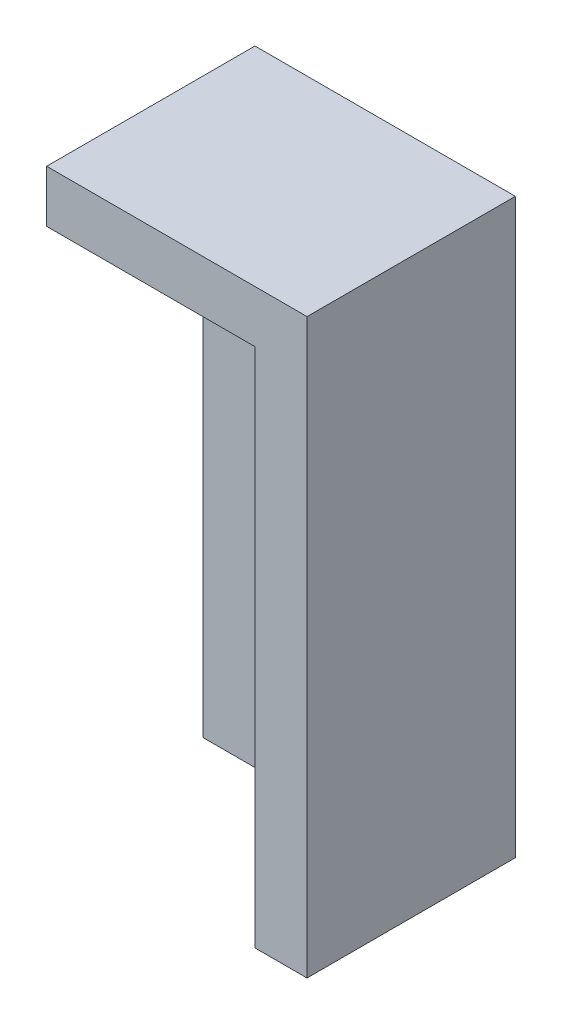
ISO-10303-21;
HEADER;
FILE_DESCRIPTION(('STEP AP214'),'2;1');
FILE_NAME('part.step','',(''),(''),'','','');
FILE_SCHEMA(('AUTOMOTIVE_DESIGN { 1 0 10303 214 1 1 1 1 }'));
ENDSEC;
DATA;
#1=APPLICATION_CONTEXT('core data for automotive mechanical design processes');
#2=APPLICATION_PROTOCOL_DEFINITION('international standard','automotive_design',2000,#1);
#3=PRODUCT_CONTEXT('',#1,'mechanical');
#4=PRODUCT('Part','Part','',(#3));
#5=PRODUCT_RELATED_PRODUCT_CATEGORY('part','',(#4));
#6=PRODUCT_DEFINITION_FORMATION('','',#4);
#7=PRODUCT_DEFINITION_CONTEXT('part definition',#1,'design');
#8=PRODUCT_DEFINITION('design','',#6,#7);
#9=PRODUCT_DEFINITION_SHAPE('','',#8);
#10=(LENGTH_UNIT() NAMED_UNIT(*) SI_UNIT(.MILLI.,.METRE.));
#11=(NAMED_UNIT(*) PLANE_ANGLE_UNIT() SI_UNIT($,.RADIAN.));
#12=(NAMED_UNIT(*) SI_UNIT($,.STERADIAN.) SOLID_ANGLE_UNIT());
#13=UNCERTAINTY_MEASURE_WITH_UNIT(LENGTH_MEASURE(1.E-05),#10,'distance_accuracy_value','');
#14=(GEOMETRIC_REPRESENTATION_CONTEXT(3) GLOBAL_UNCERTAINTY_ASSIGNED_CONTEXT((#13)) GLOBAL_UNIT_ASSIGNED_CONTEXT((#10,
#11,#12)) REPRESENTATION_CONTEXT('',''));
#15=CARTESIAN_POINT('',(0.,0.,0.));
#16=DIRECTION('',(0.,0.,1.));
#17=DIRECTION('',(1.,0.,0.));
#18=AXIS2_PLACEMENT_3D('',#15,#16,#17);
#19=CARTESIAN_POINT('',(-2.79097387173397,-35.8669833729216,5.));
#20=DIRECTION('',(0.,1.,0.));
#21=DIRECTION('',(-1.,0.,0.));
#22=AXIS2_PLACEMENT_3D('',#19,#20,#21);
#23=PLANE('',#22);
#24=DIRECTION('',(1.,0.,0.));
#25=VECTOR('',#24,1.);
#26=CARTESIAN_POINT('',(-2.79097387173397,-35.8669833729216,0.));
#27=LINE('',#26,#25);
#28=CARTESIAN_POINT('',(-2.79097387173397,-35.8669833729216,0.));
#29=VERTEX_POINT('',#28);
#30=CARTESIAN_POINT('',(22.209026128266,-35.8669833729216,0.));
#31=VERTEX_POINT('',#30);
#32=EDGE_CURVE('E128',#29,#31,#27,.T.);
#33=ORIENTED_EDGE('',*,*,#32,.T.);
#34=DIRECTION('',(0.,0.,-1.));
#35=VECTOR('',#34,1.);
#36=CARTESIAN_POINT('',(22.209026128266,-35.8669833729216,5.));
#37=LINE('',#36,#35);
#38=CARTESIAN_POINT('',(22.209026128266,-35.8669833729216,20.));
#39=VERTEX_POINT('',#38);
#40=EDGE_CURVE('E11',#39,#31,#37,.T.);
#41=ORIENTED_EDGE('',*,*,#40,.F.);
#42=DIRECTION('',(1.,0.,0.));
#43=VECTOR('',#42,1.);
#44=CARTESIAN_POINT('',(22.209026128266,-35.8669833729216,20.));
#45=LINE('',#44,#43);
#46=CARTESIAN_POINT('',(17.209026128266,-35.8669833729216,20.));
#47=VERTEX_POINT('',#46);
#48=EDGE_CURVE('E113',#47,#39,#45,.T.);
#49=ORIENTED_EDGE('',*,*,#48,.F.);
#50=DIRECTION('',(0.,0.,-1.));
#51=VECTOR('',#50,1.);
#52=CARTESIAN_POINT('',(17.209026128266,-35.8669833729216,20.));
#53=LINE('',#52,#51);
#54=CARTESIAN_POINT('',(17.209026128266,-35.8669833729216,5.));
#55=VERTEX_POINT('',#54);
#56=EDGE_CURVE('E108',#47,#55,#53,.T.);
#57=ORIENTED_EDGE('',*,*,#56,.T.);
#58=DIRECTION('',(1.,0.,0.));
#59=VECTOR('',#58,1.);
#60=CARTESIAN_POINT('',(-2.79097387173397,-35.8669833729216,5.));
#61=LINE('',#60,#59);
#62=CARTESIAN_POINT('',(-2.79097387173397,-35.8669833729216,5.));
#63=VERTEX_POINT('',#62);
#64=EDGE_CURVE('E139',#63,#55,#61,.T.);
#65=ORIENTED_EDGE('',*,*,#64,.F.);
#66=DIRECTION('',(0.,0.,-1.));
#67=VECTOR('',#66,1.);
#68=CARTESIAN_POINT('',(-2.79097387173397,-35.8669833729216,5.));
#69=LINE('',#68,#67);
#70=EDGE_CURVE('E145',#63,#29,#69,.T.);
#71=ORIENTED_EDGE('',*,*,#70,.T.);
#72=EDGE_LOOP('',(#33,#41,#49,#57,#65,#71));
#73=FACE_BOUND('',#72,.T.);
#74=ADVANCED_FACE('F45',(#73),#23,.F.);
#75=CARTESIAN_POINT('',(22.209026128266,-35.8669833729216,5.));
#76=DIRECTION('',(-1.,0.,0.));
#77=DIRECTION('',(0.,0.,1.));
#78=AXIS2_PLACEMENT_3D('',#75,#76,#77);
#79=PLANE('',#78);
#80=DIRECTION('',(0.,1.,0.));
#81=VECTOR('',#80,1.);
#82=CARTESIAN_POINT('',(22.209026128266,-35.8669833729216,0.));
#83=LINE('',#82,#81);
#84=CARTESIAN_POINT('',(22.209026128266,19.1330166270784,0.));
#85=VERTEX_POINT('',#84);
#86=EDGE_CURVE('E133',#31,#85,#83,.T.);
#87=ORIENTED_EDGE('',*,*,#86,.T.);
#88=DIRECTION('',(0.,0.,-1.));
#89=VECTOR('',#88,1.);
#90=CARTESIAN_POINT('',(22.209026128266,19.1330166270784,5.));
#91=LINE('',#90,#89);
#92=CARTESIAN_POINT('',(22.209026128266,19.1330166270784,20.));
#93=VERTEX_POINT('',#92);
#94=EDGE_CURVE('E53',#93,#85,#91,.T.);
#95=ORIENTED_EDGE('',*,*,#94,.F.);
#96=DIRECTION('',(0.,1.,0.));
#97=VECTOR('',#96,1.);
#98=CARTESIAN_POINT('',(22.209026128266,19.1330166270784,20.));
#99=LINE('',#98,#97);
#100=EDGE_CURVE('E188',#39,#93,#99,.T.);
#101=ORIENTED_EDGE('',*,*,#100,.F.);
#102=ORIENTED_EDGE('',*,*,#40,.T.);
#103=EDGE_LOOP('',(#87,#95,#101,#102));
#104=FACE_BOUND('',#103,.T.);
#105=ADVANCED_FACE('F194',(#104),#79,.F.);
#106=CARTESIAN_POINT('',(-2.79097387173397,19.1330166270784,5.));
#107=DIRECTION('',(0.,-1.,0.));
#108=DIRECTION('',(0.,0.,-1.));
#109=AXIS2_PLACEMENT_3D('',#106,#107,#108);
#110=PLANE('',#109);
#111=DIRECTION('',(-1.,0.,0.));
#112=VECTOR('',#111,1.);
#113=CARTESIAN_POINT('',(-2.79097387173397,19.1330166270784,0.));
#114=LINE('',#113,#112);
#115=CARTESIAN_POINT('',(-2.79097387173397,19.1330166270784,0.));
#116=VERTEX_POINT('',#115);
#117=EDGE_CURVE('E149',#85,#116,#114,.T.);
#118=ORIENTED_EDGE('',*,*,#117,.T.);
#119=DIRECTION('',(0.,0.,-1.));
#120=VECTOR('',#119,1.);
#121=CARTESIAN_POINT('',(-2.79097387173397,19.1330166270784,5.));
#122=LINE('',#121,#120);
#123=CARTESIAN_POINT('',(-2.79097387173397,19.1330166270784,20.));
#124=VERTEX_POINT('',#123);
#125=EDGE_CURVE('E157',#124,#116,#122,.T.);
#126=ORIENTED_EDGE('',*,*,#125,.F.);
#127=DIRECTION('',(-1.,0.,0.));
#128=VECTOR('',#127,1.);
#129=CARTESIAN_POINT('',(-2.79097387173397,19.1330166270784,20.));
#130=LINE('',#129,#128);
#131=EDGE_CURVE('E166',#93,#124,#130,.T.);
#132=ORIENTED_EDGE('',*,*,#131,.F.);
#133=ORIENTED_EDGE('',*,*,#94,.T.);
#134=EDGE_LOOP('',(#118,#126,#132,#133));
#135=FACE_BOUND('',#134,.T.);
#136=ADVANCED_FACE('F165',(#135),#110,.F.);
#137=CARTESIAN_POINT('',(-2.79097387173397,-35.8669833729216,5.));
#138=DIRECTION('',(1.,0.,0.));
#139=DIRECTION('',(0.,0.,-1.));
#140=AXIS2_PLACEMENT_3D('',#137,#138,#139);
#141=PLANE('',#140);
#142=DIRECTION('',(0.,-1.,0.));
#143=VECTOR('',#142,1.);
#144=CARTESIAN_POINT('',(-2.79097387173397,-35.8669833729216,0.));
#145=LINE('',#144,#143);
#146=EDGE_CURVE('E143',#116,#29,#145,.T.);
#147=ORIENTED_EDGE('',*,*,#146,.T.);
#148=ORIENTED_EDGE('',*,*,#70,.F.);
#149=DIRECTION('',(0.,-1.,0.));
#150=VECTOR('',#149,1.);
#151=CARTESIAN_POINT('',(-2.79097387173397,-35.8669833729216,5.));
#152=LINE('',#151,#150);
#153=CARTESIAN_POINT('',(-2.79097387173397,14.1330166270784,5.));
#154=VERTEX_POINT('',#153);
#155=EDGE_CURVE('E142',#154,#63,#152,.T.);
#156=ORIENTED_EDGE('',*,*,#155,.F.);
#157=DIRECTION('',(0.,0.,-1.));
#158=VECTOR('',#157,1.);
#159=CARTESIAN_POINT('',(-2.79097387173397,14.1330166270784,20.));
#160=LINE('',#159,#158);
#161=CARTESIAN_POINT('',(-2.79097387173397,14.1330166270784,20.));
#162=VERTEX_POINT('',#161);
#163=EDGE_CURVE('E135',#162,#154,#160,.T.);
#164=ORIENTED_EDGE('',*,*,#163,.F.);
#165=DIRECTION('',(0.,-1.,0.));
#166=VECTOR('',#165,1.);
#167=CARTESIAN_POINT('',(-2.79097387173397,14.1330166270784,20.));
#168=LINE('',#167,#166);
#169=EDGE_CURVE('E120',#124,#162,#168,.T.);
#170=ORIENTED_EDGE('',*,*,#169,.F.);
#171=ORIENTED_EDGE('',*,*,#125,.T.);
#172=EDGE_LOOP('',(#147,#148,#156,#164,#170,#171));
#173=FACE_BOUND('',#172,.T.);
#174=ADVANCED_FACE('F176',(#173),#141,.F.);
#175=CARTESIAN_POINT('',(0.,0.,5.));
#176=DIRECTION('',(0.,0.,1.));
#177=DIRECTION('',(1.,0.,0.));
#178=AXIS2_PLACEMENT_3D('',#175,#176,#177);
#179=PLANE('',#178);
#180=DIRECTION('',(1.,0.,0.));
#181=VECTOR('',#180,1.);
#182=CARTESIAN_POINT('',(17.209026128266,14.1330166270784,5.));
#183=LINE('',#182,#181);
#184=CARTESIAN_POINT('',(17.209026128266,14.1330166270784,5.));
#185=VERTEX_POINT('',#184);
#186=EDGE_CURVE('E65',#154,#185,#183,.T.);
#187=ORIENTED_EDGE('',*,*,#186,.F.);
#188=ORIENTED_EDGE('',*,*,#155,.T.);
#189=ORIENTED_EDGE('',*,*,#64,.T.);
#190=DIRECTION('',(0.,-1.,0.));
#191=VECTOR('',#190,1.);
#192=CARTESIAN_POINT('',(17.209026128266,-35.8669833729216,5.));
#193=LINE('',#192,#191);
#194=EDGE_CURVE('E60',#185,#55,#193,.T.);
#195=ORIENTED_EDGE('',*,*,#194,.F.);
#196=EDGE_LOOP('',(#187,#188,#189,#195));
#197=FACE_BOUND('',#196,.T.);
#198=ADVANCED_FACE('F179',(#197),#179,.T.);
#199=CARTESIAN_POINT('',(0.,0.,0.));
#200=DIRECTION('',(0.,0.,1.));
#201=DIRECTION('',(1.,0.,0.));
#202=AXIS2_PLACEMENT_3D('',#199,#200,#201);
#203=PLANE('',#202);
#204=ORIENTED_EDGE('',*,*,#32,.F.);
#205=ORIENTED_EDGE('',*,*,#146,.F.);
#206=ORIENTED_EDGE('',*,*,#117,.F.);
#207=ORIENTED_EDGE('',*,*,#86,.F.);
#208=EDGE_LOOP('',(#204,#205,#206,#207));
#209=FACE_BOUND('',#208,.T.);
#210=ADVANCED_FACE('F173',(#209),#203,.F.);
#211=CARTESIAN_POINT('',(17.209026128266,14.1330166270784,20.));
#212=DIRECTION('',(0.,1.,0.));
#213=DIRECTION('',(0.,0.,1.));
#214=AXIS2_PLACEMENT_3D('',#211,#212,#213);
#215=PLANE('',#214);
#216=ORIENTED_EDGE('',*,*,#186,.T.);
#217=DIRECTION('',(0.,0.,-1.));
#218=VECTOR('',#217,1.);
#219=CARTESIAN_POINT('',(17.209026128266,14.1330166270784,20.));
#220=LINE('',#219,#218);
#221=CARTESIAN_POINT('',(17.209026128266,14.1330166270784,20.));
#222=VERTEX_POINT('',#221);
#223=EDGE_CURVE('E106',#222,#185,#220,.T.);
#224=ORIENTED_EDGE('',*,*,#223,.F.);
#225=DIRECTION('',(1.,0.,0.));
#226=VECTOR('',#225,1.);
#227=CARTESIAN_POINT('',(17.209026128266,14.1330166270784,20.));
#228=LINE('',#227,#226);
#229=EDGE_CURVE('E114',#162,#222,#228,.T.);
#230=ORIENTED_EDGE('',*,*,#229,.F.);
#231=ORIENTED_EDGE('',*,*,#163,.T.);
#232=EDGE_LOOP('',(#216,#224,#230,#231));
#233=FACE_BOUND('',#232,.T.);
#234=ADVANCED_FACE('F126',(#233),#215,.F.);
#235=CARTESIAN_POINT('',(17.209026128266,-35.8669833729216,20.));
#236=DIRECTION('',(1.,0.,0.));
#237=DIRECTION('',(0.,1.,0.));
#238=AXIS2_PLACEMENT_3D('',#235,#236,#237);
#239=PLANE('',#238);
#240=ORIENTED_EDGE('',*,*,#194,.T.);
#241=ORIENTED_EDGE('',*,*,#56,.F.);
#242=DIRECTION('',(0.,-1.,0.));
#243=VECTOR('',#242,1.);
#244=CARTESIAN_POINT('',(17.209026128266,-35.8669833729216,20.));
#245=LINE('',#244,#243);
#246=EDGE_CURVE('E102',#222,#47,#245,.T.);
#247=ORIENTED_EDGE('',*,*,#246,.F.);
#248=ORIENTED_EDGE('',*,*,#223,.T.);
#249=EDGE_LOOP('',(#240,#241,#247,#248));
#250=FACE_BOUND('',#249,.T.);
#251=ADVANCED_FACE('F104',(#250),#239,.F.);
#252=CARTESIAN_POINT('',(0.,0.,20.));
#253=DIRECTION('',(0.,0.,-1.));
#254=DIRECTION('',(-1.,0.,0.));
#255=AXIS2_PLACEMENT_3D('',#252,#253,#254);
#256=PLANE('',#255);
#257=ORIENTED_EDGE('',*,*,#229,.T.);
#258=ORIENTED_EDGE('',*,*,#246,.T.);
#259=ORIENTED_EDGE('',*,*,#48,.T.);
#260=ORIENTED_EDGE('',*,*,#100,.T.);
#261=ORIENTED_EDGE('',*,*,#131,.T.);
#262=ORIENTED_EDGE('',*,*,#169,.T.);
#263=EDGE_LOOP('',(#257,#258,#259,#260,#261,#262));
#264=FACE_BOUND('',#263,.T.);
#265=ADVANCED_FACE('F117',(#264),#256,.F.);
#266=CLOSED_SHELL('',(#74,#105,#136,#174,#198,#210,#234,#251,#265));
#267=MANIFOLD_SOLID_BREP('B2',#266);
#268=ADVANCED_BREP_SHAPE_REPRESENTATION('',(#18,#267),#14);
#269=SHAPE_DEFINITION_REPRESENTATION(#9,#268);
ENDSEC;
END-ISO-10303-21;
